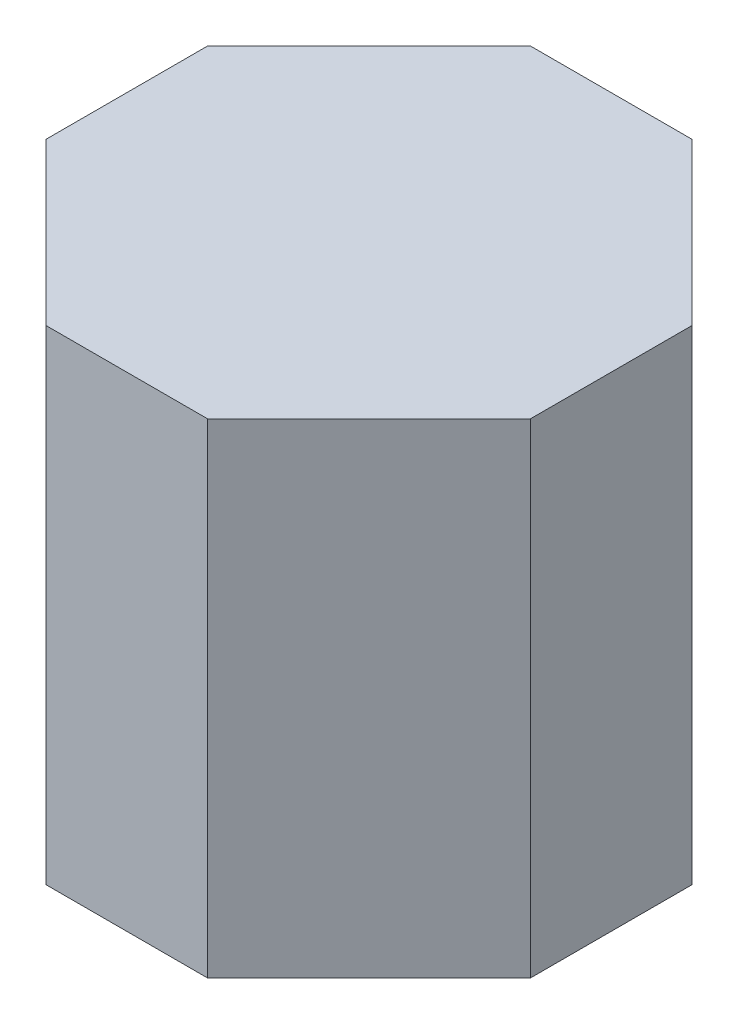
ISO-10303-21;
HEADER;
FILE_DESCRIPTION(('STEP AP214'),'2;1');
FILE_NAME('part.step','',(''),(''),'','','');
FILE_SCHEMA(('AUTOMOTIVE_DESIGN { 1 0 10303 214 1 1 1 1 }'));
ENDSEC;
DATA;
#1=APPLICATION_CONTEXT('core data for automotive mechanical design processes');
#2=APPLICATION_PROTOCOL_DEFINITION('international standard','automotive_design',2000,#1);
#3=PRODUCT_CONTEXT('',#1,'mechanical');
#4=PRODUCT('Part','Part','',(#3));
#5=PRODUCT_RELATED_PRODUCT_CATEGORY('part','',(#4));
#6=PRODUCT_DEFINITION_FORMATION('','',#4);
#7=PRODUCT_DEFINITION_CONTEXT('part definition',#1,'design');
#8=PRODUCT_DEFINITION('design','',#6,#7);
#9=PRODUCT_DEFINITION_SHAPE('','',#8);
#10=(LENGTH_UNIT() NAMED_UNIT(*) SI_UNIT(.MILLI.,.METRE.));
#11=(NAMED_UNIT(*) PLANE_ANGLE_UNIT() SI_UNIT($,.RADIAN.));
#12=(NAMED_UNIT(*) SI_UNIT($,.STERADIAN.) SOLID_ANGLE_UNIT());
#13=UNCERTAINTY_MEASURE_WITH_UNIT(LENGTH_MEASURE(1.E-05),#10,'distance_accuracy_value','');
#14=(GEOMETRIC_REPRESENTATION_CONTEXT(3) GLOBAL_UNCERTAINTY_ASSIGNED_CONTEXT((#13)) GLOBAL_UNIT_ASSIGNED_CONTEXT((#10,
#11,#12)) REPRESENTATION_CONTEXT('',''));
#15=CARTESIAN_POINT('',(0.,0.,0.));
#16=DIRECTION('',(0.,0.,1.));
#17=DIRECTION('',(1.,0.,0.));
#18=AXIS2_PLACEMENT_3D('',#15,#16,#17);
#19=CARTESIAN_POINT('',(-15.,15.,30.));
#20=DIRECTION('',(1.,0.,0.));
#21=DIRECTION('',(0.,1.,0.));
#22=AXIS2_PLACEMENT_3D('',#19,#20,#21);
#23=PLANE('',#22);
#24=DIRECTION('',(0.,0.,-1.));
#25=VECTOR('',#24,1.);
#26=CARTESIAN_POINT('',(-15.,15.,30.));
#27=LINE('',#26,#25);
#28=CARTESIAN_POINT('',(-15.,15.,20.));
#29=VERTEX_POINT('',#28);
#30=CARTESIAN_POINT('',(-15.,15.,9.99999999999994));
#31=VERTEX_POINT('',#30);
#32=EDGE_CURVE('E128',#29,#31,#27,.T.);
#33=ORIENTED_EDGE('',*,*,#32,.T.);
#34=DIRECTION('',(0.,1.,0.));
#35=VECTOR('',#34,1.);
#36=CARTESIAN_POINT('',(-15.,-15.001,9.99999999999994));
#37=LINE('',#36,#35);
#38=CARTESIAN_POINT('',(-15.,-15.,9.99999999999994));
#39=VERTEX_POINT('',#38);
#40=EDGE_CURVE('E109',#39,#31,#37,.T.);
#41=ORIENTED_EDGE('',*,*,#40,.F.);
#42=DIRECTION('',(0.,0.,-1.));
#43=VECTOR('',#42,1.);
#44=CARTESIAN_POINT('',(-15.,-15.,30.));
#45=LINE('',#44,#43);
#46=CARTESIAN_POINT('',(-15.,-15.,20.));
#47=VERTEX_POINT('',#46);
#48=EDGE_CURVE('E11',#47,#39,#45,.T.);
#49=ORIENTED_EDGE('',*,*,#48,.F.);
#50=DIRECTION('',(0.,1.,0.));
#51=VECTOR('',#50,1.);
#52=CARTESIAN_POINT('',(-15.,-15.001,20.));
#53=LINE('',#52,#51);
#54=EDGE_CURVE('E135',#47,#29,#53,.T.);
#55=ORIENTED_EDGE('',*,*,#54,.T.);
#56=EDGE_LOOP('',(#33,#41,#49,#55));
#57=FACE_BOUND('',#56,.T.);
#58=ADVANCED_FACE('F39',(#57),#23,.F.);
#59=CARTESIAN_POINT('',(-15.,-15.,30.));
#60=DIRECTION('',(0.,1.,0.));
#61=DIRECTION('',(0.,0.,1.));
#62=AXIS2_PLACEMENT_3D('',#59,#60,#61);
#63=PLANE('',#62);
#64=CARTESIAN_POINT('',(0.,-15.,14.9999999999999));
#65=DIRECTION('',(0.,-1.,0.));
#66=DIRECTION('',(0.,0.,-1.));
#67=AXIS2_PLACEMENT_3D('',#64,#65,#66);
#68=CIRCLE('',#67,2.75);
#69=CARTESIAN_POINT('',(0.,-15.,12.2499999999999));
#70=VERTEX_POINT('',#69);
#71=EDGE_CURVE('E219',#70,#70,#68,.T.);
#72=ORIENTED_EDGE('',*,*,#71,.F.);
#73=EDGE_LOOP('',(#72));
#74=FACE_BOUND('',#73,.T.);
#75=DIRECTION('',(0.,0.,-1.));
#76=VECTOR('',#75,1.);
#77=CARTESIAN_POINT('',(15.,-15.,30.));
#78=LINE('',#77,#76);
#79=CARTESIAN_POINT('',(15.,-15.,20.0000000000001));
#80=VERTEX_POINT('',#79);
#81=CARTESIAN_POINT('',(15.0000000000001,-15.,9.99999999999999));
#82=VERTEX_POINT('',#81);
#83=EDGE_CURVE('E53',#80,#82,#78,.T.);
#84=ORIENTED_EDGE('',*,*,#83,.F.);
#85=DIRECTION('',(0.707106781186546,0.,-0.707106781186549));
#86=VECTOR('',#85,1.);
#87=CARTESIAN_POINT('',(5.00000000000007,-15.,30.0000000000001));
#88=LINE('',#87,#86);
#89=CARTESIAN_POINT('',(5.00000000000007,-15.,30.0000000000001));
#90=VERTEX_POINT('',#89);
#91=EDGE_CURVE('E165',#90,#80,#88,.T.);
#92=ORIENTED_EDGE('',*,*,#91,.F.);
#93=DIRECTION('',(1.,0.,0.));
#94=VECTOR('',#93,1.);
#95=CARTESIAN_POINT('',(-15.,-15.,30.));
#96=LINE('',#95,#94);
#97=CARTESIAN_POINT('',(-5.,-15.,30.));
#98=VERTEX_POINT('',#97);
#99=EDGE_CURVE('E145',#98,#90,#96,.T.);
#100=ORIENTED_EDGE('',*,*,#99,.F.);
#101=DIRECTION('',(0.707106781186549,0.,0.707106781186546));
#102=VECTOR('',#101,1.);
#103=CARTESIAN_POINT('',(-15.,-15.,20.));
#104=LINE('',#103,#102);
#105=EDGE_CURVE('E68',#47,#98,#104,.T.);
#106=ORIENTED_EDGE('',*,*,#105,.F.);
#107=ORIENTED_EDGE('',*,*,#48,.T.);
#108=DIRECTION('',(-0.707106781186549,0.,0.707106781186546));
#109=VECTOR('',#108,1.);
#110=CARTESIAN_POINT('',(-4.99999999999999,-15.,0.));
#111=LINE('',#110,#109);
#112=CARTESIAN_POINT('',(-4.99999999999999,-15.,0.));
#113=VERTEX_POINT('',#112);
#114=EDGE_CURVE('E115',#113,#39,#111,.T.);
#115=ORIENTED_EDGE('',*,*,#114,.F.);
#116=DIRECTION('',(1.,0.,0.));
#117=VECTOR('',#116,1.);
#118=CARTESIAN_POINT('',(-15.,-15.,0.));
#119=LINE('',#118,#117);
#120=CARTESIAN_POINT('',(5.00000000000008,-15.,0.));
#121=VERTEX_POINT('',#120);
#122=EDGE_CURVE('E170',#113,#121,#119,.T.);
#123=ORIENTED_EDGE('',*,*,#122,.T.);
#124=DIRECTION('',(-0.707106781186549,0.,-0.707106781186546));
#125=VECTOR('',#124,1.);
#126=CARTESIAN_POINT('',(15.0000000000001,-15.,9.99999999999999));
#127=LINE('',#126,#125);
#128=EDGE_CURVE('E168',#82,#121,#127,.T.);
#129=ORIENTED_EDGE('',*,*,#128,.F.);
#130=EDGE_LOOP('',(#84,#92,#100,#106,#107,#115,#123,#129));
#131=FACE_BOUND('',#130,.T.);
#132=ADVANCED_FACE('F163',(#74,#131),#63,.F.);
#133=CARTESIAN_POINT('',(15.,15.,30.));
#134=DIRECTION('',(-1.,0.,0.));
#135=DIRECTION('',(0.,-1.,0.));
#136=AXIS2_PLACEMENT_3D('',#133,#134,#135);
#137=PLANE('',#136);
#138=DIRECTION('',(0.,0.,-1.));
#139=VECTOR('',#138,1.);
#140=CARTESIAN_POINT('',(15.,15.,30.));
#141=LINE('',#140,#139);
#142=CARTESIAN_POINT('',(15.,15.,20.0000000000001));
#143=VERTEX_POINT('',#142);
#144=CARTESIAN_POINT('',(15.0000000000001,15.,9.99999999999999));
#145=VERTEX_POINT('',#144);
#146=EDGE_CURVE('E137',#143,#145,#141,.T.);
#147=ORIENTED_EDGE('',*,*,#146,.F.);
#148=DIRECTION('',(0.,1.,0.));
#149=VECTOR('',#148,1.);
#150=CARTESIAN_POINT('',(15.,-15.001,20.0000000000001));
#151=LINE('',#150,#149);
#152=EDGE_CURVE('E159',#80,#143,#151,.T.);
#153=ORIENTED_EDGE('',*,*,#152,.F.);
#154=ORIENTED_EDGE('',*,*,#83,.T.);
#155=DIRECTION('',(0.,1.,0.));
#156=VECTOR('',#155,1.);
#157=CARTESIAN_POINT('',(15.0000000000001,-15.001,9.99999999999999));
#158=LINE('',#157,#156);
#159=EDGE_CURVE('E158',#82,#145,#158,.T.);
#160=ORIENTED_EDGE('',*,*,#159,.T.);
#161=EDGE_LOOP('',(#147,#153,#154,#160));
#162=FACE_BOUND('',#161,.T.);
#163=ADVANCED_FACE('F157',(#162),#137,.F.);
#164=CARTESIAN_POINT('',(-15.,15.,30.));
#165=DIRECTION('',(0.,-1.,0.));
#166=DIRECTION('',(0.,0.,-1.));
#167=AXIS2_PLACEMENT_3D('',#164,#165,#166);
#168=PLANE('',#167);
#169=DIRECTION('',(-1.,0.,0.));
#170=VECTOR('',#169,1.);
#171=CARTESIAN_POINT('',(-15.,15.,30.));
#172=LINE('',#171,#170);
#173=CARTESIAN_POINT('',(5.00000000000006,15.,30.));
#174=VERTEX_POINT('',#173);
#175=CARTESIAN_POINT('',(-5.,15.,30.));
#176=VERTEX_POINT('',#175);
#177=EDGE_CURVE('E138',#174,#176,#172,.T.);
#178=ORIENTED_EDGE('',*,*,#177,.F.);
#179=DIRECTION('',(-0.707106781186546,0.,0.707106781186549));
#180=VECTOR('',#179,1.);
#181=CARTESIAN_POINT('',(5.00000000000007,15.,30.0000000000001));
#182=LINE('',#181,#180);
#183=EDGE_CURVE('E60',#143,#174,#182,.T.);
#184=ORIENTED_EDGE('',*,*,#183,.F.);
#185=ORIENTED_EDGE('',*,*,#146,.T.);
#186=DIRECTION('',(0.707106781186549,0.,0.707106781186546));
#187=VECTOR('',#186,1.);
#188=CARTESIAN_POINT('',(15.0000000000001,15.,9.99999999999999));
#189=LINE('',#188,#187);
#190=CARTESIAN_POINT('',(5.00000000000008,15.,0.));
#191=VERTEX_POINT('',#190);
#192=EDGE_CURVE('E174',#191,#145,#189,.T.);
#193=ORIENTED_EDGE('',*,*,#192,.F.);
#194=DIRECTION('',(-1.,0.,0.));
#195=VECTOR('',#194,1.);
#196=CARTESIAN_POINT('',(-15.,15.,0.));
#197=LINE('',#196,#195);
#198=CARTESIAN_POINT('',(-4.99999999999999,15.,0.));
#199=VERTEX_POINT('',#198);
#200=EDGE_CURVE('E131',#191,#199,#197,.T.);
#201=ORIENTED_EDGE('',*,*,#200,.T.);
#202=DIRECTION('',(0.707106781186549,0.,-0.707106781186547));
#203=VECTOR('',#202,1.);
#204=CARTESIAN_POINT('',(-4.99999999999999,15.,0.));
#205=LINE('',#204,#203);
#206=EDGE_CURVE('E112',#31,#199,#205,.T.);
#207=ORIENTED_EDGE('',*,*,#206,.F.);
#208=ORIENTED_EDGE('',*,*,#32,.F.);
#209=DIRECTION('',(-0.707106781186549,0.,-0.707106781186546));
#210=VECTOR('',#209,1.);
#211=CARTESIAN_POINT('',(-15.,15.,20.));
#212=LINE('',#211,#210);
#213=EDGE_CURVE('E197',#176,#29,#212,.T.);
#214=ORIENTED_EDGE('',*,*,#213,.F.);
#215=EDGE_LOOP('',(#178,#184,#185,#193,#201,#207,#208,#214));
#216=FACE_BOUND('',#215,.T.);
#217=ADVANCED_FACE('F126',(#216),#168,.F.);
#218=CARTESIAN_POINT('',(0.,0.,30.));
#219=DIRECTION('',(0.,0.,1.));
#220=DIRECTION('',(1.,0.,0.));
#221=AXIS2_PLACEMENT_3D('',#218,#219,#220);
#222=PLANE('',#221);
#223=DIRECTION('',(0.,1.,0.));
#224=VECTOR('',#223,1.);
#225=CARTESIAN_POINT('',(5.00000000000007,-15.001,30.0000000000001));
#226=LINE('',#225,#224);
#227=EDGE_CURVE('E175',#90,#174,#226,.T.);
#228=ORIENTED_EDGE('',*,*,#227,.T.);
#229=ORIENTED_EDGE('',*,*,#177,.T.);
#230=DIRECTION('',(0.,1.,0.));
#231=VECTOR('',#230,1.);
#232=CARTESIAN_POINT('',(-5.,-15.001,30.));
#233=LINE('',#232,#231);
#234=EDGE_CURVE('E200',#98,#176,#233,.T.);
#235=ORIENTED_EDGE('',*,*,#234,.F.);
#236=ORIENTED_EDGE('',*,*,#99,.T.);
#237=EDGE_LOOP('',(#228,#229,#235,#236));
#238=FACE_BOUND('',#237,.T.);
#239=ADVANCED_FACE('F250',(#238),#222,.T.);
#240=CARTESIAN_POINT('',(0.,0.,0.));
#241=DIRECTION('',(0.,0.,1.));
#242=DIRECTION('',(1.,0.,0.));
#243=AXIS2_PLACEMENT_3D('',#240,#241,#242);
#244=PLANE('',#243);
#245=ORIENTED_EDGE('',*,*,#200,.F.);
#246=DIRECTION('',(0.,1.,0.));
#247=VECTOR('',#246,1.);
#248=CARTESIAN_POINT('',(5.00000000000008,-15.001,0.));
#249=LINE('',#248,#247);
#250=EDGE_CURVE('E179',#121,#191,#249,.T.);
#251=ORIENTED_EDGE('',*,*,#250,.F.);
#252=ORIENTED_EDGE('',*,*,#122,.F.);
#253=DIRECTION('',(0.,1.,0.));
#254=VECTOR('',#253,1.);
#255=CARTESIAN_POINT('',(-4.99999999999999,-15.001,0.));
#256=LINE('',#255,#254);
#257=EDGE_CURVE('E120',#113,#199,#256,.T.);
#258=ORIENTED_EDGE('',*,*,#257,.T.);
#259=EDGE_LOOP('',(#245,#251,#252,#258));
#260=FACE_BOUND('',#259,.T.);
#261=ADVANCED_FACE('F251',(#260),#244,.F.);
#262=CARTESIAN_POINT('',(-4.99999999999999,-15.001,0.));
#263=DIRECTION('',(0.707106781186546,0.,0.707106781186548));
#264=DIRECTION('',(0.707106781186549,0.,-0.707106781186546));
#265=AXIS2_PLACEMENT_3D('',#262,#263,#264);
#266=PLANE('',#265);
#267=ORIENTED_EDGE('',*,*,#114,.T.);
#268=ORIENTED_EDGE('',*,*,#40,.T.);
#269=ORIENTED_EDGE('',*,*,#206,.T.);
#270=ORIENTED_EDGE('',*,*,#257,.F.);
#271=EDGE_LOOP('',(#267,#268,#269,#270));
#272=FACE_BOUND('',#271,.T.);
#273=ADVANCED_FACE('F111',(#272),#266,.F.);
#274=CARTESIAN_POINT('',(15.0000000000001,-15.001,9.99999999999999));
#275=DIRECTION('',(-0.707106781186546,0.,0.707106781186549));
#276=DIRECTION('',(0.707106781186549,0.,0.707106781186546));
#277=AXIS2_PLACEMENT_3D('',#274,#275,#276);
#278=PLANE('',#277);
#279=CARTESIAN_POINT('',(9.99924494298891,-4.99999999999999,4.99924494298884));
#280=DIRECTION('',(-0.707106781186546,0.,0.707106781186549));
#281=DIRECTION('',(0.707106781186549,0.,0.707106781186546));
#282=AXIS2_PLACEMENT_3D('',#279,#280,#281);
#283=CIRCLE('',#282,3.25);
#284=CARTESIAN_POINT('',(12.2973419818452,-4.99999999999999,7.29734198184512));
#285=VERTEX_POINT('',#284);
#286=EDGE_CURVE('E190',#285,#285,#283,.F.);
#287=ORIENTED_EDGE('',*,*,#286,.F.);
#288=EDGE_LOOP('',(#287));
#289=FACE_BOUND('',#288,.T.);
#290=ORIENTED_EDGE('',*,*,#128,.T.);
#291=ORIENTED_EDGE('',*,*,#250,.T.);
#292=ORIENTED_EDGE('',*,*,#192,.T.);
#293=ORIENTED_EDGE('',*,*,#159,.F.);
#294=EDGE_LOOP('',(#290,#291,#292,#293));
#295=FACE_BOUND('',#294,.T.);
#296=ADVANCED_FACE('F261',(#289,#295),#278,.F.);
#297=CARTESIAN_POINT('',(-15.,-15.001,20.));
#298=DIRECTION('',(0.707106781186546,0.,-0.707106781186549));
#299=DIRECTION('',(-0.707106781186549,0.,-0.707106781186546));
#300=AXIS2_PLACEMENT_3D('',#297,#298,#299);
#301=PLANE('',#300);
#302=CARTESIAN_POINT('',(-10.0007550570111,-4.99999999999999,24.9992449429889));
#303=DIRECTION('',(-0.707106781186546,0.,0.707106781186549));
#304=DIRECTION('',(0.707106781186549,0.,0.707106781186546));
#305=AXIS2_PLACEMENT_3D('',#302,#303,#304);
#306=CIRCLE('',#305,3.25);
#307=CARTESIAN_POINT('',(-7.70265801815482,-4.99999999999999,27.2973419818452));
#308=VERTEX_POINT('',#307);
#309=EDGE_CURVE('E215',#308,#308,#306,.T.);
#310=ORIENTED_EDGE('',*,*,#309,.F.);
#311=EDGE_LOOP('',(#310));
#312=FACE_BOUND('',#311,.T.);
#313=ORIENTED_EDGE('',*,*,#105,.T.);
#314=ORIENTED_EDGE('',*,*,#234,.T.);
#315=ORIENTED_EDGE('',*,*,#213,.T.);
#316=ORIENTED_EDGE('',*,*,#54,.F.);
#317=EDGE_LOOP('',(#313,#314,#315,#316));
#318=FACE_BOUND('',#317,.T.);
#319=ADVANCED_FACE('F258',(#312,#318),#301,.F.);
#320=CARTESIAN_POINT('',(5.00000000000007,-15.001,30.0000000000001));
#321=DIRECTION('',(-0.707106781186549,0.,-0.707106781186546));
#322=DIRECTION('',(-0.707106781186546,0.,0.707106781186549));
#323=AXIS2_PLACEMENT_3D('',#320,#321,#322);
#324=PLANE('',#323);
#325=ORIENTED_EDGE('',*,*,#91,.T.);
#326=ORIENTED_EDGE('',*,*,#152,.T.);
#327=ORIENTED_EDGE('',*,*,#183,.T.);
#328=ORIENTED_EDGE('',*,*,#227,.F.);
#329=EDGE_LOOP('',(#325,#326,#327,#328));
#330=FACE_BOUND('',#329,.T.);
#331=ADVANCED_FACE('F236',(#330),#324,.F.);
#332=CARTESIAN_POINT('',(15.0002449429889,-4.99999999999999,-0.00175505701118656));
#333=DIRECTION('',(-0.707106781186546,0.,0.707106781186549));
#334=DIRECTION('',(0.707106781186549,0.,0.707106781186546));
#335=AXIS2_PLACEMENT_3D('',#332,#333,#334);
#336=CYLINDRICAL_SURFACE('',#335,3.25);
#337=CARTESIAN_POINT('',(0.,-7.60488035681848,12.2499999999999));
#338=CARTESIAN_POINT('',(0.140110224433985,-7.67879483641387,12.2499983288187));
#339=CARTESIAN_POINT('',(0.28171809767576,-7.75032415110686,12.2606848526085));
#340=CARTESIAN_POINT('',(0.566059974067989,-7.88402596585779,12.3050468140022));
#341=CARTESIAN_POINT('',(0.70879496338298,-7.94618901905401,12.3387452746024));
#342=CARTESIAN_POINT('',(0.96817971233871,-8.04716477049519,12.4230888385029));
#343=CARTESIAN_POINT('',(1.08519749346852,-8.08814419932009,12.4699542883568));
#344=CARTESIAN_POINT('',(1.31452644676917,-8.15754382756051,12.5811746189149));
#345=CARTESIAN_POINT('',(1.42684296261417,-8.1859786571009,12.6455089842359));
#346=CARTESIAN_POINT('',(1.64382453230427,-8.22814400857401,12.7914874459536));
#347=CARTESIAN_POINT('',(1.74843664348058,-8.24178029875001,12.8732385506208));
#348=CARTESIAN_POINT('',(1.94516039455409,-8.25270455984371,13.0515509111668));
#349=CARTESIAN_POINT('',(2.03727506214097,-8.24999649767859,13.1481085678217));
#350=CARTESIAN_POINT('',(2.1971611784785,-8.2296283765484,13.3419448496191));
#351=CARTESIAN_POINT('',(2.26645783278308,-8.2135231575388,13.4381432926039));
#352=CARTESIAN_POINT('',(2.39113068735151,-8.16959522097827,13.6366440347374));
#353=CARTESIAN_POINT('',(2.44650414926841,-8.14177020130715,13.7389475297108));
#354=CARTESIAN_POINT('',(2.54542477885675,-8.07453141008985,13.9522259019167));
#355=CARTESIAN_POINT('',(2.58823294260864,-8.03460308522833,14.0633777309679));
#356=CARTESIAN_POINT('',(2.65854359934613,-7.94615452591593,14.2869750548234));
#357=CARTESIAN_POINT('',(2.6860428206142,-7.89763245779014,14.3994208209219));
#358=CARTESIAN_POINT('',(2.73634062238014,-7.769291107067,14.6781970344968));
#359=CARTESIAN_POINT('',(2.75048950066196,-7.68565706024785,14.8443843184337));
#360=CARTESIAN_POINT('',(2.74973434953386,-7.55514930877107,15.0909486199352));
#361=CARTESIAN_POINT('',(2.74577824601098,-7.51067500753928,15.1729048716344));
#362=CARTESIAN_POINT('',(2.73065133808076,-7.42099453805996,15.3357394216486));
#363=CARTESIAN_POINT('',(2.7194835691918,-7.37578868553698,15.4166181588963));
#364=CARTESIAN_POINT('',(2.68968479868939,-7.28480686607558,15.5788216382283));
#365=CARTESIAN_POINT('',(2.67091035544435,-7.23903734168875,15.6601234847216));
#366=CARTESIAN_POINT('',(2.62573562419552,-7.14916189240793,15.8216124474021));
#367=CARTESIAN_POINT('',(2.59933056904939,-7.10505702702634,15.9017988337926));
#368=CARTESIAN_POINT('',(2.53867273287438,-7.02057659543116,16.0605778549314));
#369=CARTESIAN_POINT('',(2.50446381608952,-6.98018189091996,16.139176821181));
#370=CARTESIAN_POINT('',(2.4275672349596,-6.90536327284987,16.2949697957201));
#371=CARTESIAN_POINT('',(2.38489383092735,-6.87092949706012,16.3721659318027));
#372=CARTESIAN_POINT('',(2.29258694158448,-6.81265054265928,16.5211352866731));
#373=CARTESIAN_POINT('',(2.24336546010736,-6.78839009978779,16.592994373187));
#374=CARTESIAN_POINT('',(2.13670271853893,-6.75164064649433,16.7334155451424));
#375=CARTESIAN_POINT('',(2.07928456999718,-6.73911926318858,16.8019861999917));
#376=CARTESIAN_POINT('',(1.95691868775092,-6.72808814168722,16.9341967955875));
#377=CARTESIAN_POINT('',(1.89192546765753,-6.72966785892324,16.9978026709425));
#378=CARTESIAN_POINT('',(1.75694897092399,-6.74672729863229,17.1174999237797));
#379=CARTESIAN_POINT('',(1.68695687629717,-6.7622321717503,17.1735774934191));
#380=CARTESIAN_POINT('',(1.52247949144695,-6.81076649321224,17.2929927276107));
#381=CARTESIAN_POINT('',(1.42702497870812,-6.84769423399684,17.3533426459808));
#382=CARTESIAN_POINT('',(1.23358233522585,-6.93320572951063,17.4603014217756));
#383=CARTESIAN_POINT('',(1.13558673933711,-6.98182841153888,17.5068632046793));
#384=CARTESIAN_POINT('',(0.957221240073486,-7.07508750047065,17.5794520173026));
#385=CARTESIAN_POINT('',(0.877164091150507,-7.11863530472309,17.6077154466479));
#386=CARTESIAN_POINT('',(0.715832098662497,-7.20783548459039,17.6565378859818));
#387=CARTESIAN_POINT('',(0.634556614718847,-7.25348899519726,17.6770926851496));
#388=CARTESIAN_POINT('',(0.470722867985673,-7.34546342059419,17.7107043849362));
#389=CARTESIAN_POINT('',(0.388163233025182,-7.39178504481226,17.7237526050553));
#390=CARTESIAN_POINT('',(0.221894926189153,-7.48387170239894,17.7423089610045));
#391=CARTESIAN_POINT('',(0.138186313740401,-7.52963676432458,17.7478174853253));
#392=CARTESIAN_POINT('',(-0.0324029147477168,-7.62073875124491,17.7511655533857));
#393=CARTESIAN_POINT('',(-0.119309820390019,-7.66603458835019,17.7488047741524));
#394=CARTESIAN_POINT('',(-0.293893775680241,-7.75391709380291,17.735651697381));
#395=CARTESIAN_POINT('',(-0.381570975704978,-7.7965032191564,17.7248577156478));
#396=CARTESIAN_POINT('',(-0.556910269445497,-7.87777310640089,17.6944829322547));
#397=CARTESIAN_POINT('',(-0.644571583733065,-7.91646844338983,17.6749291986535));
#398=CARTESIAN_POINT('',(-0.819331479305336,-7.988989767092,17.6266731836961));
#399=CARTESIAN_POINT('',(-0.906430389021951,-8.02281889923108,17.5979768508694));
#400=CARTESIAN_POINT('',(-1.10546831399391,-8.093932643019,17.5209142046955));
#401=CARTESIAN_POINT('',(-1.2169041458198,-8.12913817711181,17.4692198043601));
#402=CARTESIAN_POINT('',(-1.43419760219645,-8.1870160799723,17.3496659124933));
#403=CARTESIAN_POINT('',(-1.5400595177454,-8.20969822118622,17.281819084614));
#404=CARTESIAN_POINT('',(-1.74328197594061,-8.24081713501955,17.1306256829786));
#405=CARTESIAN_POINT('',(-1.84059995817337,-8.24918604928088,17.0472073438731));
#406=CARTESIAN_POINT('',(-2.02268055052598,-8.25069986158794,16.8675166197976));
#407=CARTESIAN_POINT('',(-2.1074439285582,-8.24384569117631,16.7712450216927));
#408=CARTESIAN_POINT('',(-2.25633566244438,-8.2165718889525,16.5765163676634));
#409=CARTESIAN_POINT('',(-2.32150540990197,-8.19715606553496,16.4787064622817));
#410=CARTESIAN_POINT('',(-2.43785741708978,-8.14716246639317,16.2778249606034));
#411=CARTESIAN_POINT('',(-2.48903738409692,-8.11658286300217,16.1747525051318));
#412=CARTESIAN_POINT('',(-2.5805897166759,-8.04349326392745,15.9580750515779));
#413=CARTESIAN_POINT('',(-2.61987378315205,-8.00026455015405,15.8442572140599));
#414=CARTESIAN_POINT('',(-2.68279395885305,-7.90555500098953,15.6157821199466));
#415=CARTESIAN_POINT('',(-2.70641823499373,-7.85406796172086,15.5011242946183));
#416=CARTESIAN_POINT('',(-2.74687778356564,-7.71845956742824,15.2163599108231));
#417=CARTESIAN_POINT('',(-2.75470047443591,-7.63071764723418,15.0466390288094));
#418=CARTESIAN_POINT('',(-2.74366300898998,-7.49519973957538,14.7953660895452));
#419=CARTESIAN_POINT('',(-2.7361582750605,-7.44929971633133,14.7120292244872));
#420=CARTESIAN_POINT('',(-2.71363517489537,-7.35725134283539,14.5465185776268));
#421=CARTESIAN_POINT('',(-2.69861911224478,-7.31110307300591,14.4643444471753));
#422=CARTESIAN_POINT('',(-2.65027904815393,-7.1935400491431,14.2543923254991));
#423=CARTESIAN_POINT('',(-2.61139450891062,-7.12280692448991,14.1274766774437));
#424=CARTESIAN_POINT('',(-2.51372615530136,-6.99032913524022,13.8767431552193));
#425=CARTESIAN_POINT('',(-2.45500353058025,-6.92855765641493,13.7529169978854));
#426=CARTESIAN_POINT('',(-2.34169134428677,-6.84451009483026,13.5555069793119));
#427=CARTESIAN_POINT('',(-2.29395691685623,-6.81613574586313,13.480653320235));
#428=CARTESIAN_POINT('',(-2.18961438140149,-6.77073139556888,13.333818691084));
#429=CARTESIAN_POINT('',(-2.13302883650493,-6.75367311164897,13.2618309850346));
#430=CARTESIAN_POINT('',(-2.01114594769707,-6.73386060554154,13.1221192988261));
#431=CARTESIAN_POINT('',(-1.94577228529223,-6.73124125471548,13.0544413386714));
#432=CARTESIAN_POINT('',(-1.80903211795483,-6.74127126612172,12.9266727539279));
#433=CARTESIAN_POINT('',(-1.73766009792796,-6.75393482608061,12.8665892418525));
#434=CARTESIAN_POINT('',(-1.57692029473214,-6.79573947301999,12.7443445075912));
#435=CARTESIAN_POINT('',(-1.4868067521013,-6.82766791248396,12.6841679870703));
#436=CARTESIAN_POINT('',(-1.30389391379741,-6.90348042463973,12.5764237818829));
#437=CARTESIAN_POINT('',(-1.21108505426041,-6.9474133822724,12.5289092572938));
#438=CARTESIAN_POINT('',(-1.04104913756079,-7.03330779575063,12.4532971103342));
#439=CARTESIAN_POINT('',(-0.964098224788971,-7.07414380411481,12.423235319716));
#440=CARTESIAN_POINT('',(-0.809048761897602,-7.15840548706545,12.3704272177064));
#441=CARTESIAN_POINT('',(-0.730949425661599,-7.20183300433168,12.3476861869782));
#442=CARTESIAN_POINT('',(-0.573843158413432,-7.28966815310278,12.3093262257879));
#443=CARTESIAN_POINT('',(-0.494838923981211,-7.33407311878846,12.293689959968));
#444=CARTESIAN_POINT('',(-0.335742724789365,-7.42282882259914,12.269386817525));
#445=CARTESIAN_POINT('',(-0.255651008893868,-7.46717957068115,12.2607183728047));
#446=CARTESIAN_POINT('',(-0.146022149919844,-7.52681555031088,12.2537253992234));
#447=CARTESIAN_POINT('',(-0.116905630922347,-7.54255264827212,12.252330927467));
#448=CARTESIAN_POINT('',(-0.05854792941716,-7.57385475406955,12.2504683258717));
#449=CARTESIAN_POINT('',(-0.0293067270529602,-7.58941973295955,12.2500003495594));
#450=CARTESIAN_POINT('',(0.,-7.60488035681848,12.2499999999999));
#451=B_SPLINE_CURVE_WITH_KNOTS('',3,(#337,#338,#339,#340,#341,#342,#343,#344,#345,#346,#347,
#348,#349,#350,#351,#352,#353,#354,#355,#356,#357,#358,#359,#360,#361,#362,#363,#364,#365,#366,
#367,#368,#369,#370,#371,#372,#373,#374,#375,#376,#377,#378,#379,#380,#381,#382,#383,#384,#385,
#386,#387,#388,#389,#390,#391,#392,#393,#394,#395,#396,#397,#398,#399,#400,#401,#402,#403,#404,
#405,#406,#407,#408,#409,#410,#411,#412,#413,#414,#415,#416,#417,#418,#419,#420,#421,#422,#423,
#424,#425,#426,#427,#428,#429,#430,#431,#432,#433,#434,#435,#436,#437,#438,#439,#440,#441,#442,
#443,#444,#445,#446,#447,#448,#449,#450),.UNSPECIFIED.,.T.,.F.,(4,2,2,2,2,2,2,2,2,2,2,2,2,2,2,2,
2,2,2,2,2,2,2,2,2,2,2,2,2,2,2,2,2,2,2,2,2,2,2,2,2,2,2,2,2,2,2,2,2,2,2,2,2,2,2,2,4),(0.,
0.475137695590988,0.950751455032962,1.34677339278492,1.74233224150856,2.14039534895961,
2.53836184690105,2.895695679681,3.25309973629692,3.62856418442201,4.00410884334578,
4.5606090359658,4.84039750525281,5.12006828328661,5.40527844821305,5.69066718174301,
5.97448967899806,6.25783801435279,6.52811218196237,6.79763880112976,7.06887646910117,
7.34060501499369,7.69506397699645,8.05071951400166,8.33661884053103,8.62267411219737,
8.90905951255337,9.19543015604169,9.48914582618076,9.78292016927664,10.0757929307729,
10.368475525713,10.7501881732637,11.1316025344346,11.5148202021078,11.8980144202784,
12.2538408737545,12.609725607135,12.9921058183206,13.3747746409604,13.945127256213,
14.2312201209766,14.5172253001132,14.9671891745469,15.415777639575,15.6945001435189,
15.9725233764072,16.2531392267483,16.5340159682183,16.8710284257172,17.2094342659177,
17.4855541354362,17.7618727337426,18.03751345618,18.3130921287285,18.4124597799055,
18.5118438956152),.UNSPECIFIED.);
#452=CARTESIAN_POINT('',(0.,-7.60488035681848,12.2499999999999));
#453=VERTEX_POINT('',#452);
#454=EDGE_CURVE('E42',#453,#453,#451,.T.);
#455=ORIENTED_EDGE('',*,*,#454,.T.);
#456=EDGE_LOOP('',(#455));
#457=FACE_BOUND('',#456,.T.);
#458=ORIENTED_EDGE('',*,*,#309,.T.);
#459=EDGE_LOOP('',(#458));
#460=FACE_BOUND('',#459,.T.);
#461=ORIENTED_EDGE('',*,*,#286,.T.);
#462=EDGE_LOOP('',(#461));
#463=FACE_BOUND('',#462,.T.);
#464=ADVANCED_FACE('F228',(#457,#460,#463),#336,.F.);
#465=CARTESIAN_POINT('',(0.,-4.99999999999999,14.9999999999999));
#466=DIRECTION('',(0.,-1.,0.));
#467=DIRECTION('',(0.,0.,-1.));
#468=AXIS2_PLACEMENT_3D('',#465,#466,#467);
#469=CYLINDRICAL_SURFACE('',#468,2.75);
#470=ORIENTED_EDGE('',*,*,#71,.T.);
#471=EDGE_LOOP('',(#470));
#472=FACE_BOUND('',#471,.T.);
#473=ORIENTED_EDGE('',*,*,#454,.F.);
#474=EDGE_LOOP('',(#473));
#475=FACE_BOUND('',#474,.T.);
#476=ADVANCED_FACE('F231',(#472,#475),#469,.F.);
#477=CLOSED_SHELL('',(#58,#132,#163,#217,#239,#261,#273,#296,#319,#331,#464,#476));
#478=MANIFOLD_SOLID_BREP('B2',#477);
#479=ADVANCED_BREP_SHAPE_REPRESENTATION('',(#18,#478),#14);
#480=SHAPE_DEFINITION_REPRESENTATION(#9,#479);
ENDSEC;
END-ISO-10303-21;
